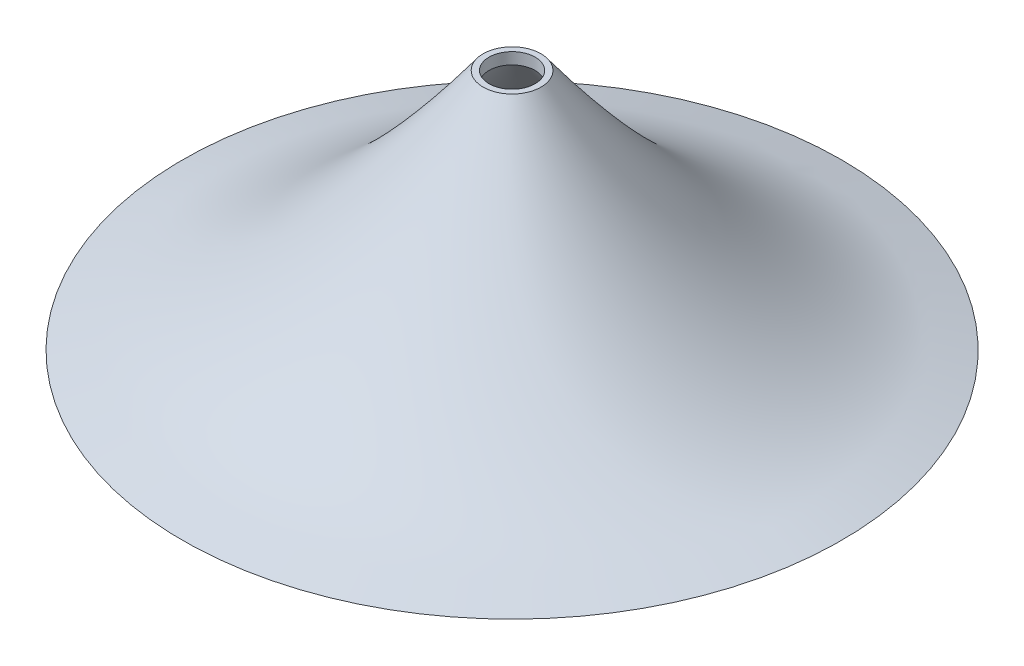
ISO-10303-21;
HEADER;
FILE_DESCRIPTION(('STEP AP214'),'2;1');
FILE_NAME('part.step','',(''),(''),'','','');
FILE_SCHEMA(('AUTOMOTIVE_DESIGN { 1 0 10303 214 1 1 1 1 }'));
ENDSEC;
DATA;
#1=APPLICATION_CONTEXT('core data for automotive mechanical design processes');
#2=APPLICATION_PROTOCOL_DEFINITION('international standard','automotive_design',2000,#1);
#3=PRODUCT_CONTEXT('',#1,'mechanical');
#4=PRODUCT('Part','Part','',(#3));
#5=PRODUCT_RELATED_PRODUCT_CATEGORY('part','',(#4));
#6=PRODUCT_DEFINITION_FORMATION('','',#4);
#7=PRODUCT_DEFINITION_CONTEXT('part definition',#1,'design');
#8=PRODUCT_DEFINITION('design','',#6,#7);
#9=PRODUCT_DEFINITION_SHAPE('','',#8);
#10=(LENGTH_UNIT() NAMED_UNIT(*) SI_UNIT(.MILLI.,.METRE.));
#11=(NAMED_UNIT(*) PLANE_ANGLE_UNIT() SI_UNIT($,.RADIAN.));
#12=(NAMED_UNIT(*) SI_UNIT($,.STERADIAN.) SOLID_ANGLE_UNIT());
#13=UNCERTAINTY_MEASURE_WITH_UNIT(LENGTH_MEASURE(1.E-05),#10,'distance_accuracy_value','');
#14=(GEOMETRIC_REPRESENTATION_CONTEXT(3) GLOBAL_UNCERTAINTY_ASSIGNED_CONTEXT((#13)) GLOBAL_UNIT_ASSIGNED_CONTEXT((#10,
#11,#12)) REPRESENTATION_CONTEXT('',''));
#15=CARTESIAN_POINT('',(0.,0.,0.));
#16=DIRECTION('',(0.,0.,1.));
#17=DIRECTION('',(1.,0.,0.));
#18=AXIS2_PLACEMENT_3D('',#15,#16,#17);
#19=CARTESIAN_POINT('',(0.,0.,0.));
#20=DIRECTION('',(0.,1.,0.));
#21=DIRECTION('',(0.,0.,1.));
#22=AXIS2_PLACEMENT_3D('',#19,#20,#21);
#23=PLANE('',#22);
#24=CARTESIAN_POINT('',(0.,0.,0.));
#25=DIRECTION('',(0.,-1.,0.));
#26=DIRECTION('',(0.,0.,-1.));
#27=AXIS2_PLACEMENT_3D('',#24,#25,#26);
#28=CIRCLE('',#27,635.);
#29=CARTESIAN_POINT('',(0.,0.,-635.));
#30=VERTEX_POINT('',#29);
#31=EDGE_CURVE('E47',#30,#30,#28,.T.);
#32=ORIENTED_EDGE('',*,*,#31,.F.);
#33=EDGE_LOOP('',(#32));
#34=FACE_BOUND('',#33,.T.);
#35=CARTESIAN_POINT('',(0.,0.,0.));
#36=DIRECTION('',(0.,-1.,0.));
#37=DIRECTION('',(0.,0.,-1.));
#38=AXIS2_PLACEMENT_3D('',#35,#36,#37);
#39=CIRCLE('',#38,725.847783338383);
#40=CARTESIAN_POINT('',(0.,0.,-725.847783338383));
#41=VERTEX_POINT('',#40);
#42=EDGE_CURVE('E42',#41,#41,#39,.T.);
#43=ORIENTED_EDGE('',*,*,#42,.T.);
#44=EDGE_LOOP('',(#43));
#45=FACE_BOUND('',#44,.T.);
#46=ADVANCED_FACE('F31',(#34,#45),#23,.F.);
#47=CARTESIAN_POINT('',(0.,533.4,0.));
#48=DIRECTION('',(0.,-1.,0.));
#49=DIRECTION('',(0.,0.,-1.));
#50=AXIS2_PLACEMENT_3D('',#47,#48,#49);
#51=PLANE('',#50);
#52=CARTESIAN_POINT('',(0.,533.4,0.));
#53=DIRECTION('',(0.,-1.,0.));
#54=DIRECTION('',(0.,0.,-1.));
#55=AXIS2_PLACEMENT_3D('',#52,#53,#54);
#56=CIRCLE('',#55,50.8);
#57=CARTESIAN_POINT('',(0.,533.4,-50.8));
#58=VERTEX_POINT('',#57);
#59=EDGE_CURVE('E54',#58,#58,#56,.T.);
#60=ORIENTED_EDGE('',*,*,#59,.T.);
#61=EDGE_LOOP('',(#60));
#62=FACE_BOUND('',#61,.T.);
#63=CARTESIAN_POINT('',(0.,533.4,0.));
#64=DIRECTION('',(0.,-1.,0.));
#65=DIRECTION('',(0.,0.,-1.));
#66=AXIS2_PLACEMENT_3D('',#63,#64,#65);
#67=CIRCLE('',#66,63.7134080402253);
#68=CARTESIAN_POINT('',(0.,533.4,-63.7134080402253));
#69=VERTEX_POINT('',#68);
#70=EDGE_CURVE('E10',#69,#69,#67,.T.);
#71=ORIENTED_EDGE('',*,*,#70,.F.);
#72=EDGE_LOOP('',(#71));
#73=FACE_BOUND('',#72,.T.);
#74=ADVANCED_FACE('F58',(#62,#73),#51,.F.);
#75=CARTESIAN_POINT('',(-43.1910554049857,518.433602894655,0.));
#76=CARTESIAN_POINT('',(-46.9955277024928,513.216801447328,0.));
#77=CARTESIAN_POINT('',(-363.644011984527,79.0193249197713,0.));
#78=CARTESIAN_POINT('',(-676.873117086189,-12.1935228650587,0.));
#79=CARTESIAN_POINT('',(-718.746234172379,-24.3870457301172,0.));
#80=B_SPLINE_CURVE_WITH_KNOTS('',2,(#75,#76,#77,#78,#79),.UNSPECIFIED.,.F.,.F.,(3,1,1,3),
(-0.00351270893008843,0.,0.288852137349719,0.333425096495736),.UNSPECIFIED.);
#81=CARTESIAN_POINT('',(0.,0.,0.));
#82=DIRECTION('',(0.,-1.,0.));
#83=AXIS1_PLACEMENT('',#81,#82);
#84=SURFACE_OF_REVOLUTION('',#80,#83);
#85=OFFSET_SURFACE('',#84,25.4,.F.);
#86=ORIENTED_EDGE('',*,*,#42,.F.);
#87=EDGE_LOOP('',(#86));
#88=FACE_BOUND('',#87,.T.);
#89=ORIENTED_EDGE('',*,*,#70,.T.);
#90=EDGE_LOOP('',(#89));
#91=FACE_BOUND('',#90,.T.);
#92=ADVANCED_FACE('F68',(#88,#91),#85,.T.);
#93=CARTESIAN_POINT('',(-43.1910554049857,518.433602894655,0.));
#94=CARTESIAN_POINT('',(-46.9955277024928,513.216801447328,0.));
#95=CARTESIAN_POINT('',(-50.8,508.,0.));
#96=CARTESIAN_POINT('',(-363.644011984527,79.0193249197713,0.));
#97=CARTESIAN_POINT('',(-635.,0.,0.));
#98=CARTESIAN_POINT('',(-676.873117086189,-12.1935228650587,0.));
#99=CARTESIAN_POINT('',(-718.746234172379,-24.3870457301172,0.));
#100=B_SPLINE_CURVE_WITH_KNOTS('',2,(#93,#94,#95,#96,#97,#98,#99),.UNSPECIFIED.,.F.,.F.,(3,2,2,
3),(-0.00351270893008843,0.,0.288852137349719,0.333425096495736),.UNSPECIFIED.);
#101=CARTESIAN_POINT('',(0.,0.,0.));
#102=DIRECTION('',(0.,-1.,0.));
#103=AXIS1_PLACEMENT('',#101,#102);
#104=SURFACE_OF_REVOLUTION('',#100,#103);
#105=ORIENTED_EDGE('',*,*,#31,.T.);
#106=EDGE_LOOP('',(#105));
#107=FACE_BOUND('',#106,.T.);
#108=CARTESIAN_POINT('',(0.,508.,0.));
#109=DIRECTION('',(0.,-1.,0.));
#110=DIRECTION('',(0.,0.,-1.));
#111=AXIS2_PLACEMENT_3D('',#108,#109,#110);
#112=CIRCLE('',#111,50.8);
#113=CARTESIAN_POINT('',(0.,508.,-50.8));
#114=VERTEX_POINT('',#113);
#115=EDGE_CURVE('E51',#114,#114,#112,.T.);
#116=ORIENTED_EDGE('',*,*,#115,.F.);
#117=EDGE_LOOP('',(#116));
#118=FACE_BOUND('',#117,.T.);
#119=ADVANCED_FACE('F33',(#107,#118),#104,.F.);
#120=CARTESIAN_POINT('',(0.,533.4,0.));
#121=DIRECTION('',(0.,-1.,0.));
#122=DIRECTION('',(0.,0.,-1.));
#123=AXIS2_PLACEMENT_3D('',#120,#121,#122);
#124=CYLINDRICAL_SURFACE('',#123,50.8);
#125=ORIENTED_EDGE('',*,*,#115,.T.);
#126=EDGE_LOOP('',(#125));
#127=FACE_BOUND('',#126,.T.);
#128=ORIENTED_EDGE('',*,*,#59,.F.);
#129=EDGE_LOOP('',(#128));
#130=FACE_BOUND('',#129,.T.);
#131=ADVANCED_FACE('F61',(#127,#130),#124,.F.);
#132=CLOSED_SHELL('',(#46,#74,#92,#119,#131));
#133=MANIFOLD_SOLID_BREP('B2',#132);
#134=ADVANCED_BREP_SHAPE_REPRESENTATION('',(#18,#133),#14);
#135=SHAPE_DEFINITION_REPRESENTATION(#9,#134);
ENDSEC;
END-ISO-10303-21;
